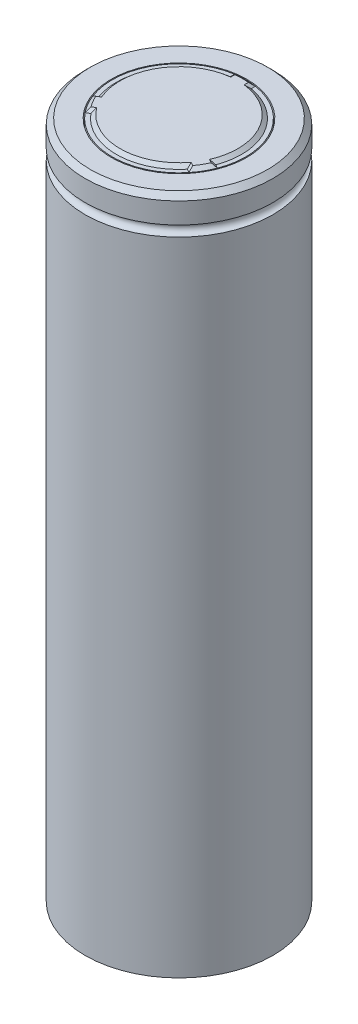
ISO-10303-21;
HEADER;
FILE_DESCRIPTION(('STEP AP214'),'2;1');
FILE_NAME('part.step','',(''),(''),'','','');
FILE_SCHEMA(('AUTOMOTIVE_DESIGN { 1 0 10303 214 1 1 1 1 }'));
ENDSEC;
DATA;
#1=APPLICATION_CONTEXT('core data for automotive mechanical design processes');
#2=APPLICATION_PROTOCOL_DEFINITION('international standard','automotive_design',2000,#1);
#3=PRODUCT_CONTEXT('',#1,'mechanical');
#4=PRODUCT('Part','Part','',(#3));
#5=PRODUCT_RELATED_PRODUCT_CATEGORY('part','',(#4));
#6=PRODUCT_DEFINITION_FORMATION('','',#4);
#7=PRODUCT_DEFINITION_CONTEXT('part definition',#1,'design');
#8=PRODUCT_DEFINITION('design','',#6,#7);
#9=PRODUCT_DEFINITION_SHAPE('','',#8);
#10=(LENGTH_UNIT() NAMED_UNIT(*) SI_UNIT(.MILLI.,.METRE.));
#11=(NAMED_UNIT(*) PLANE_ANGLE_UNIT() SI_UNIT($,.RADIAN.));
#12=(NAMED_UNIT(*) SI_UNIT($,.STERADIAN.) SOLID_ANGLE_UNIT());
#13=UNCERTAINTY_MEASURE_WITH_UNIT(LENGTH_MEASURE(1.E-05),#10,'distance_accuracy_value','');
#14=(GEOMETRIC_REPRESENTATION_CONTEXT(3) GLOBAL_UNCERTAINTY_ASSIGNED_CONTEXT((#13)) GLOBAL_UNIT_ASSIGNED_CONTEXT((#10,
#11,#12)) REPRESENTATION_CONTEXT('',''));
#15=CARTESIAN_POINT('',(0.,0.,0.));
#16=DIRECTION('',(0.,0.,1.));
#17=DIRECTION('',(1.,0.,0.));
#18=AXIS2_PLACEMENT_3D('',#15,#16,#17);
#19=CARTESIAN_POINT('',(0.,65.,0.));
#20=DIRECTION('',(0.,-1.,0.));
#21=DIRECTION('',(0.,0.,-1.));
#22=AXIS2_PLACEMENT_3D('',#19,#20,#21);
#23=CYLINDRICAL_SURFACE('',#22,9.);
#24=CARTESIAN_POINT('',(0.,0.,0.));
#25=DIRECTION('',(0.,1.,0.));
#26=DIRECTION('',(0.,0.,1.));
#27=AXIS2_PLACEMENT_3D('',#24,#25,#26);
#28=CIRCLE('',#27,9.);
#29=CARTESIAN_POINT('',(0.,0.,9.));
#30=VERTEX_POINT('',#29);
#31=EDGE_CURVE('E58',#30,#30,#28,.T.);
#32=ORIENTED_EDGE('',*,*,#31,.T.);
#33=EDGE_LOOP('',(#32));
#34=FACE_BOUND('',#33,.T.);
#35=CARTESIAN_POINT('',(0.,61.5,0.));
#36=DIRECTION('',(0.,1.,0.));
#37=DIRECTION('',(0.,0.,1.));
#38=AXIS2_PLACEMENT_3D('',#35,#36,#37);
#39=CIRCLE('',#38,9.);
#40=CARTESIAN_POINT('',(0.,61.5,9.));
#41=VERTEX_POINT('',#40);
#42=EDGE_CURVE('E64',#41,#41,#39,.T.);
#43=ORIENTED_EDGE('',*,*,#42,.F.);
#44=EDGE_LOOP('',(#43));
#45=FACE_BOUND('',#44,.T.);
#46=ADVANCED_FACE('F43',(#34,#45),#23,.T.);
#47=CARTESIAN_POINT('',(0.,0.,0.));
#48=DIRECTION('',(0.,1.,0.));
#49=DIRECTION('',(0.,0.,1.));
#50=AXIS2_PLACEMENT_3D('',#47,#48,#49);
#51=PLANE('',#50);
#52=CARTESIAN_POINT('',(0.,0.,0.));
#53=DIRECTION('',(0.,-1.,0.));
#54=DIRECTION('',(0.,0.,-1.));
#55=AXIS2_PLACEMENT_3D('',#52,#53,#54);
#56=CIRCLE('',#55,6.5);
#57=CARTESIAN_POINT('',(0.,0.,-6.5));
#58=VERTEX_POINT('',#57);
#59=EDGE_CURVE('E11',#58,#58,#56,.T.);
#60=ORIENTED_EDGE('',*,*,#59,.F.);
#61=EDGE_LOOP('',(#60));
#62=FACE_BOUND('',#61,.T.);
#63=ORIENTED_EDGE('',*,*,#31,.F.);
#64=EDGE_LOOP('',(#63));
#65=FACE_BOUND('',#64,.T.);
#66=ADVANCED_FACE('F45',(#62,#65),#51,.F.);
#67=CARTESIAN_POINT('',(0.,62.,0.));
#68=DIRECTION('',(0.,-1.,0.));
#69=DIRECTION('',(0.,0.,-1.));
#70=AXIS2_PLACEMENT_3D('',#67,#68,#69);
#71=TOROIDAL_SURFACE('',#70,9.,0.500000000000001);
#72=CARTESIAN_POINT('',(0.,62.5,0.));
#73=DIRECTION('',(0.,-1.,0.));
#74=DIRECTION('',(0.,0.,-1.));
#75=AXIS2_PLACEMENT_3D('',#72,#73,#74);
#76=CIRCLE('',#75,9.);
#77=CARTESIAN_POINT('',(0.,62.5,-9.));
#78=VERTEX_POINT('',#77);
#79=EDGE_CURVE('E61',#78,#78,#76,.T.);
#80=ORIENTED_EDGE('',*,*,#79,.T.);
#81=EDGE_LOOP('',(#80));
#82=FACE_BOUND('',#81,.T.);
#83=ORIENTED_EDGE('',*,*,#42,.T.);
#84=EDGE_LOOP('',(#83));
#85=FACE_BOUND('',#84,.T.);
#86=ADVANCED_FACE('F92',(#82,#85),#71,.F.);
#87=CARTESIAN_POINT('',(0.,65.,0.));
#88=DIRECTION('',(0.,1.,0.));
#89=DIRECTION('',(0.,0.,1.));
#90=AXIS2_PLACEMENT_3D('',#87,#88,#89);
#91=PLANE('',#90);
#92=CARTESIAN_POINT('',(0.,65.,0.));
#93=DIRECTION('',(0.,-1.,0.));
#94=DIRECTION('',(0.,0.,-1.));
#95=AXIS2_PLACEMENT_3D('',#92,#93,#94);
#96=CIRCLE('',#95,6.5);
#97=CARTESIAN_POINT('',(0.,65.,-6.5));
#98=VERTEX_POINT('',#97);
#99=EDGE_CURVE('E47',#98,#98,#96,.T.);
#100=ORIENTED_EDGE('',*,*,#99,.T.);
#101=EDGE_LOOP('',(#100));
#102=FACE_BOUND('',#101,.T.);
#103=CARTESIAN_POINT('',(0.,65.,0.));
#104=DIRECTION('',(0.,1.,0.));
#105=DIRECTION('',(0.,0.,1.));
#106=AXIS2_PLACEMENT_3D('',#103,#104,#105);
#107=CIRCLE('',#106,8.5);
#108=CARTESIAN_POINT('',(0.,65.,8.5));
#109=VERTEX_POINT('',#108);
#110=EDGE_CURVE('E55',#109,#109,#107,.T.);
#111=ORIENTED_EDGE('',*,*,#110,.T.);
#112=EDGE_LOOP('',(#111));
#113=FACE_BOUND('',#112,.T.);
#114=ADVANCED_FACE('F73',(#102,#113),#91,.T.);
#115=CARTESIAN_POINT('',(0.,64.5,0.));
#116=DIRECTION('',(0.,1.,0.));
#117=DIRECTION('',(0.,0.,1.));
#118=AXIS2_PLACEMENT_3D('',#115,#116,#117);
#119=CIRCLE('',#118,9.);
#120=CARTESIAN_POINT('',(0.,64.5,9.));
#121=VERTEX_POINT('',#120);
#122=EDGE_CURVE('E51',#121,#121,#119,.F.);
#123=ORIENTED_EDGE('',*,*,#122,.T.);
#124=EDGE_LOOP('',(#123));
#125=FACE_BOUND('',#124,.T.);
#126=ORIENTED_EDGE('',*,*,#79,.F.);
#127=EDGE_LOOP('',(#126));
#128=FACE_BOUND('',#127,.T.);
#129=ADVANCED_FACE('F82',(#125,#128),#23,.T.);
#130=CARTESIAN_POINT('',(0.,65.,0.));
#131=DIRECTION('',(0.,-1.,0.));
#132=DIRECTION('',(0.,0.,-1.));
#133=AXIS2_PLACEMENT_3D('',#130,#131,#132);
#134=CONICAL_SURFACE('',#133,8.5,0.785398163397447);
#135=ORIENTED_EDGE('',*,*,#122,.F.);
#136=EDGE_LOOP('',(#135));
#137=FACE_BOUND('',#136,.T.);
#138=ORIENTED_EDGE('',*,*,#110,.F.);
#139=EDGE_LOOP('',(#138));
#140=FACE_BOUND('',#139,.T.);
#141=ADVANCED_FACE('F77',(#137,#140),#134,.T.);
#142=CARTESIAN_POINT('',(0.,65.,0.));
#143=DIRECTION('',(0.,-1.,0.));
#144=DIRECTION('',(0.,0.,-1.));
#145=AXIS2_PLACEMENT_3D('',#142,#143,#144);
#146=CYLINDRICAL_SURFACE('',#145,6.5);
#147=ORIENTED_EDGE('',*,*,#99,.F.);
#148=EDGE_LOOP('',(#147));
#149=FACE_BOUND('',#148,.T.);
#150=ORIENTED_EDGE('',*,*,#59,.T.);
#151=EDGE_LOOP('',(#150));
#152=FACE_BOUND('',#151,.T.);
#153=ADVANCED_FACE('F75',(#149,#152),#146,.F.);
#154=CLOSED_SHELL('',(#46,#66,#86,#114,#129,#141,#153));
#155=MANIFOLD_SOLID_BREP('B2',#154);
#156=CARTESIAN_POINT('',(0.,65.,0.));
#157=DIRECTION('',(0.,1.,0.));
#158=DIRECTION('',(0.,0.,1.));
#159=AXIS2_PLACEMENT_3D('',#156,#157,#158);
#160=PLANE('',#159);
#161=DIRECTION('',(0.,0.,-1.));
#162=VECTOR('',#161,1.);
#163=CARTESIAN_POINT('',(1.,65.,-5.91607978309962));
#164=LINE('',#163,#162);
#165=CARTESIAN_POINT('',(1.,65.,-5.91607978309962));
#166=VERTEX_POINT('',#165);
#167=CARTESIAN_POINT('',(1.,65.,-6.32139225171164));
#168=VERTEX_POINT('',#167);
#169=EDGE_CURVE('E178',#166,#168,#164,.T.);
#170=ORIENTED_EDGE('',*,*,#169,.F.);
#171=CARTESIAN_POINT('',(0.,65.,0.));
#172=DIRECTION('',(0.,1.,0.));
#173=DIRECTION('',(0.,0.,1.));
#174=AXIS2_PLACEMENT_3D('',#171,#172,#173);
#175=CIRCLE('',#174,6.);
#176=CARTESIAN_POINT('',(5.62347538298004,65.,2.09201448776472));
#177=VERTEX_POINT('',#176);
#178=EDGE_CURVE('E182',#177,#166,#175,.T.);
#179=ORIENTED_EDGE('',*,*,#178,.F.);
#180=DIRECTION('',(-0.86602540378444,0.,-0.499999999999998));
#181=VECTOR('',#180,1.);
#182=CARTESIAN_POINT('',(5.62347538298004,65.,2.09201448776472));
#183=LINE('',#182,#181);
#184=CARTESIAN_POINT('',(5.97448627726865,65.,2.29467072207074));
#185=VERTEX_POINT('',#184);
#186=EDGE_CURVE('E461',#185,#177,#183,.T.);
#187=ORIENTED_EDGE('',*,*,#186,.F.);
#188=CARTESIAN_POINT('',(0.,65.,0.));
#189=DIRECTION('',(0.,-1.,0.));
#190=DIRECTION('',(0.,0.,-1.));
#191=AXIS2_PLACEMENT_3D('',#188,#189,#190);
#192=CIRCLE('',#191,6.4);
#193=EDGE_CURVE('E41',#168,#185,#192,.T.);
#194=ORIENTED_EDGE('',*,*,#193,.F.);
#195=EDGE_LOOP('',(#170,#179,#187,#194));
#196=FACE_BOUND('',#195,.T.);
#197=ADVANCED_FACE('F161',(#196),#160,.T.);
#198=DIRECTION('',(0.86602540378443,0.,0.500000000000014));
#199=VECTOR('',#198,1.);
#200=CARTESIAN_POINT('',(4.62347538298032,65.,3.82406529533362));
#201=LINE('',#200,#199);
#202=CARTESIAN_POINT('',(4.62347538298032,65.,3.82406529533362));
#203=VERTEX_POINT('',#202);
#204=CARTESIAN_POINT('',(4.9744862772689,65.,4.02672152963963));
#205=VERTEX_POINT('',#204);
#206=EDGE_CURVE('E455',#203,#205,#201,.T.);
#207=ORIENTED_EDGE('',*,*,#206,.F.);
#208=CARTESIAN_POINT('',(0.,65.,0.));
#209=DIRECTION('',(0.,1.,0.));
#210=DIRECTION('',(0.,0.,1.));
#211=AXIS2_PLACEMENT_3D('',#208,#209,#210);
#212=CIRCLE('',#211,6.);
#213=CARTESIAN_POINT('',(-4.62347538297945,65.,3.82406529533467));
#214=VERTEX_POINT('',#213);
#215=EDGE_CURVE('E452',#214,#203,#212,.T.);
#216=ORIENTED_EDGE('',*,*,#215,.F.);
#217=DIRECTION('',(0.866025403784399,0.,-0.500000000000068));
#218=VECTOR('',#217,1.);
#219=CARTESIAN_POINT('',(-4.62347538297945,65.,3.82406529533467));
#220=LINE('',#219,#218);
#221=CARTESIAN_POINT('',(-4.97448627726803,65.,4.02672152964071));
#222=VERTEX_POINT('',#221);
#223=EDGE_CURVE('E262',#222,#214,#220,.T.);
#224=ORIENTED_EDGE('',*,*,#223,.F.);
#225=EDGE_CURVE('E170',#205,#222,#192,.T.);
#226=ORIENTED_EDGE('',*,*,#225,.F.);
#227=EDGE_LOOP('',(#207,#216,#224,#226));
#228=FACE_BOUND('',#227,.T.);
#229=ADVANCED_FACE('F426',(#228),#160,.T.);
#230=DIRECTION('',(0.,0.,1.));
#231=VECTOR('',#230,1.);
#232=CARTESIAN_POINT('',(-1.,65.,-5.91607978309962));
#233=LINE('',#232,#231);
#234=CARTESIAN_POINT('',(-1.,65.,-6.32139225171164));
#235=VERTEX_POINT('',#234);
#236=CARTESIAN_POINT('',(-1.,65.,-5.91607978309962));
#237=VERTEX_POINT('',#236);
#238=EDGE_CURVE('E270',#235,#237,#233,.T.);
#239=ORIENTED_EDGE('',*,*,#238,.F.);
#240=CARTESIAN_POINT('',(-5.97448627726827,65.,2.29467072207195));
#241=VERTEX_POINT('',#240);
#242=EDGE_CURVE('E171',#241,#235,#192,.T.);
#243=ORIENTED_EDGE('',*,*,#242,.F.);
#244=DIRECTION('',(-0.866025403784439,0.,0.5));
#245=VECTOR('',#244,1.);
#246=CARTESIAN_POINT('',(-5.6234753829796,65.,2.09201448776591));
#247=LINE('',#246,#245);
#248=CARTESIAN_POINT('',(-5.6234753829796,65.,2.09201448776591));
#249=VERTEX_POINT('',#248);
#250=EDGE_CURVE('E263',#249,#241,#247,.T.);
#251=ORIENTED_EDGE('',*,*,#250,.F.);
#252=CARTESIAN_POINT('',(0.,65.,0.));
#253=DIRECTION('',(0.,1.,0.));
#254=DIRECTION('',(0.,0.,1.));
#255=AXIS2_PLACEMENT_3D('',#252,#253,#254);
#256=CIRCLE('',#255,6.);
#257=EDGE_CURVE('E279',#237,#249,#256,.T.);
#258=ORIENTED_EDGE('',*,*,#257,.F.);
#259=EDGE_LOOP('',(#239,#243,#251,#258));
#260=FACE_BOUND('',#259,.T.);
#261=ADVANCED_FACE('F267',(#260),#160,.T.);
#262=CARTESIAN_POINT('',(0.,65.,0.));
#263=DIRECTION('',(0.,-1.,0.));
#264=DIRECTION('',(0.,0.,-1.));
#265=AXIS2_PLACEMENT_3D('',#262,#263,#264);
#266=CYLINDRICAL_SURFACE('',#265,6.4);
#267=ORIENTED_EDGE('',*,*,#193,.T.);
#268=CARTESIAN_POINT('',(0.,65.,0.));
#269=DIRECTION('',(0.,1.,0.));
#270=DIRECTION('',(0.,0.,1.));
#271=AXIS2_PLACEMENT_3D('',#268,#269,#270);
#272=CIRCLE('',#271,6.4);
#273=EDGE_CURVE('E458',#205,#185,#272,.T.);
#274=ORIENTED_EDGE('',*,*,#273,.F.);
#275=ORIENTED_EDGE('',*,*,#225,.T.);
#276=CARTESIAN_POINT('',(0.,65.,0.));
#277=DIRECTION('',(0.,1.,0.));
#278=DIRECTION('',(0.,0.,1.));
#279=AXIS2_PLACEMENT_3D('',#276,#277,#278);
#280=CIRCLE('',#279,6.40000000000009);
#281=EDGE_CURVE('E252',#241,#222,#280,.T.);
#282=ORIENTED_EDGE('',*,*,#281,.F.);
#283=ORIENTED_EDGE('',*,*,#242,.T.);
#284=CARTESIAN_POINT('',(0.,65.,0.));
#285=DIRECTION('',(0.,1.,0.));
#286=DIRECTION('',(0.,0.,1.));
#287=AXIS2_PLACEMENT_3D('',#284,#285,#286);
#288=CIRCLE('',#287,6.4);
#289=EDGE_CURVE('E464',#168,#235,#288,.T.);
#290=ORIENTED_EDGE('',*,*,#289,.F.);
#291=EDGE_LOOP('',(#267,#274,#275,#282,#283,#290));
#292=FACE_BOUND('',#291,.T.);
#293=CARTESIAN_POINT('',(0.,0.,0.));
#294=DIRECTION('',(0.,-1.,0.));
#295=DIRECTION('',(0.,0.,-1.));
#296=AXIS2_PLACEMENT_3D('',#293,#294,#295);
#297=CIRCLE('',#296,6.4);
#298=CARTESIAN_POINT('',(0.,0.,-6.4));
#299=VERTEX_POINT('',#298);
#300=EDGE_CURVE('E165',#299,#299,#297,.T.);
#301=ORIENTED_EDGE('',*,*,#300,.F.);
#302=EDGE_LOOP('',(#301));
#303=FACE_BOUND('',#302,.T.);
#304=ADVANCED_FACE('F254',(#292,#303),#266,.T.);
#305=CARTESIAN_POINT('',(0.,0.,0.));
#306=DIRECTION('',(0.,1.,0.));
#307=DIRECTION('',(0.,0.,1.));
#308=AXIS2_PLACEMENT_3D('',#305,#306,#307);
#309=PLANE('',#308);
#310=ORIENTED_EDGE('',*,*,#300,.T.);
#311=EDGE_LOOP('',(#310));
#312=FACE_BOUND('',#311,.T.);
#313=ADVANCED_FACE('F163',(#312),#309,.F.);
#314=CARTESIAN_POINT('',(0.,65.,0.));
#315=DIRECTION('',(0.,-1.,0.));
#316=DIRECTION('',(0.,0.,1.));
#317=AXIS2_PLACEMENT_3D('',#314,#315,#316);
#318=CONICAL_SURFACE('',#317,6.,0.872664625997166);
#319=ORIENTED_EDGE('',*,*,#257,.T.);
#320=CARTESIAN_POINT('',(-5.17598251743624,65.3,2.24648991587919));
#321=CARTESIAN_POINT('',(-5.25115520215108,65.250412684668,2.22165286289833));
#322=CARTESIAN_POINT('',(-5.32603266043692,65.2006189971599,2.19636136828668));
#323=CARTESIAN_POINT('',(-5.47519694755329,65.1006189961826,2.14486955676353));
#324=CARTESIAN_POINT('',(-5.54948377778191,65.0504126836907,2.1186692420041));
#325=CARTESIAN_POINT('',(-5.62347538297961,65.,2.09201448776594));
#326=B_SPLINE_CURVE_WITH_KNOTS('',3,(#320,#321,#322,#323,#324,#325),.UNSPECIFIED.,.F.,.F.,(4,2,
4),(0.,0.280234442872825,0.560468222200871),.UNSPECIFIED.);
#327=CARTESIAN_POINT('',(-5.17598251743624,65.3,2.24648991587919));
#328=VERTEX_POINT('',#327);
#329=EDGE_CURVE('E277',#328,#249,#326,.T.);
#330=ORIENTED_EDGE('',*,*,#329,.F.);
#331=CARTESIAN_POINT('',(0.,65.3,0.));
#332=DIRECTION('',(0.,1.,0.));
#333=DIRECTION('',(0.,0.,1.));
#334=AXIS2_PLACEMENT_3D('',#331,#332,#333);
#335=CIRCLE('',#334,5.64247392222174);
#336=CARTESIAN_POINT('',(-0.642473922221742,65.3,-5.60577730758344));
#337=VERTEX_POINT('',#336);
#338=EDGE_CURVE('E301',#337,#328,#335,.T.);
#339=ORIENTED_EDGE('',*,*,#338,.F.);
#340=CARTESIAN_POINT('',(-0.642473922221742,65.3,-5.60577730758344));
#341=CARTESIAN_POINT('',(-0.701569783415724,65.250412684668,-5.65846023572674));
#342=CARTESIAN_POINT('',(-0.760911589392015,65.2006189971599,-5.71066026946726));
#343=CARTESIAN_POINT('',(-0.880086949816134,65.1006189961826,-5.81409442568584));
#344=CARTESIAN_POINT('',(-0.939920503099257,65.0504126836907,-5.86532855045072));
#345=CARTESIAN_POINT('',(-0.999999999999985,65.,-5.91607978309964));
#346=B_SPLINE_CURVE_WITH_KNOTS('',3,(#340,#341,#342,#343,#344,#345),.UNSPECIFIED.,.F.,.F.,(4,2,
4),(0.,0.280234442872816,0.560468222200854),.UNSPECIFIED.);
#347=EDGE_CURVE('E323',#337,#237,#346,.T.);
#348=ORIENTED_EDGE('',*,*,#347,.T.);
#349=EDGE_LOOP('',(#319,#330,#339,#348));
#350=FACE_BOUND('',#349,.T.);
#351=ADVANCED_FACE('F309',(#350),#318,.T.);
#352=CARTESIAN_POINT('',(-5.6234753829796,65.,2.09201448776591));
#353=DIRECTION('',(-0.321393804843269,0.766044443118979,-0.556670399226419));
#354=DIRECTION('',(0.,0.587858883152554,0.808963493304013));
#355=AXIS2_PLACEMENT_3D('',#352,#353,#354);
#356=PLANE('',#355);
#357=ORIENTED_EDGE('',*,*,#250,.T.);
#358=CARTESIAN_POINT('',(-5.52450889038715,65.3,2.44771171112208));
#359=CARTESIAN_POINT('',(-5.6000618867935,65.2503942101823,2.42306880811691));
#360=CARTESIAN_POINT('',(-5.6753365375039,65.20059129027,2.39799392777606));
#361=CARTESIAN_POINT('',(-5.82532899869278,65.1005912894875,2.34698026304472));
#362=CARTESIAN_POINT('',(-5.90004681027609,65.0503942093999,2.32104148036887));
#363=CARTESIAN_POINT('',(-5.97448627726828,65.,2.29467072207198));
#364=B_SPLINE_CURVE_WITH_KNOTS('',3,(#358,#359,#360,#361,#362,#363),.UNSPECIFIED.,.F.,.F.,(4,2,
4),(0.,0.281030570328733,0.562060582915407),.UNSPECIFIED.);
#365=CARTESIAN_POINT('',(-5.52450889038715,65.3,2.44771171112208));
#366=VERTEX_POINT('',#365);
#367=EDGE_CURVE('E274',#366,#241,#364,.T.);
#368=ORIENTED_EDGE('',*,*,#367,.F.);
#369=DIRECTION('',(0.866025403784439,0.,-0.5));
#370=VECTOR('',#369,1.);
#371=CARTESIAN_POINT('',(-5.44471234409047,65.3,2.40164115363729));
#372=LINE('',#371,#370);
#373=EDGE_CURVE('E469',#328,#366,#372,.F.);
#374=ORIENTED_EDGE('',*,*,#373,.F.);
#375=ORIENTED_EDGE('',*,*,#329,.T.);
#376=EDGE_LOOP('',(#357,#368,#374,#375));
#377=FACE_BOUND('',#376,.T.);
#378=ADVANCED_FACE('F273',(#377),#356,.T.);
#379=CARTESIAN_POINT('',(0.,65.,0.));
#380=DIRECTION('',(0.,-1.,0.));
#381=DIRECTION('',(0.,0.,1.));
#382=AXIS2_PLACEMENT_3D('',#379,#380,#381);
#383=CONICAL_SURFACE('',#382,6.40000000000009,0.872664625997166);
#384=ORIENTED_EDGE('',*,*,#281,.T.);
#385=CARTESIAN_POINT('',(-4.88203496816532,65.3,3.56050918694812));
#386=CARTESIAN_POINT('',(-4.898470086343,65.2503942101823,3.63826145267065));
#387=CARTESIAN_POINT('',(-4.91439192832616,65.20059129027,3.71598865261728));
#388=CARTESIAN_POINT('',(-4.94520902932311,65.1005912894875,3.87139276674868));
#389=CARTESIAN_POINT('',(-4.96010429037422,65.0503942093999,3.94906968103294));
#390=CARTESIAN_POINT('',(-4.97448627726814,65.,4.0267215296408));
#391=B_SPLINE_CURVE_WITH_KNOTS('',3,(#385,#386,#387,#388,#389,#390),.UNSPECIFIED.,.F.,.F.,(4,2,
4),(0.,0.28103057032874,0.562060582915426),.UNSPECIFIED.);
#392=CARTESIAN_POINT('',(-4.88203496816532,65.3,3.56050918694812));
#393=VERTEX_POINT('',#392);
#394=EDGE_CURVE('E283',#393,#222,#391,.T.);
#395=ORIENTED_EDGE('',*,*,#394,.F.);
#396=CARTESIAN_POINT('',(0.,65.3,0.));
#397=DIRECTION('',(0.,1.,0.));
#398=DIRECTION('',(0.,0.,1.));
#399=AXIS2_PLACEMENT_3D('',#396,#397,#398);
#400=CIRCLE('',#399,6.04247392222183);
#401=EDGE_CURVE('E282',#366,#393,#400,.T.);
#402=ORIENTED_EDGE('',*,*,#401,.F.);
#403=ORIENTED_EDGE('',*,*,#367,.T.);
#404=EDGE_LOOP('',(#384,#395,#402,#403));
#405=FACE_BOUND('',#404,.T.);
#406=ADVANCED_FACE('F281',(#405),#383,.T.);
#407=CARTESIAN_POINT('',(-4.62347538297945,65.,3.82406529533467));
#408=DIRECTION('',(0.321393804843313,0.766044443118979,0.556670399226393));
#409=DIRECTION('',(0.,-0.587858883152537,0.808963493304026));
#410=AXIS2_PLACEMENT_3D('',#407,#408,#409);
#411=PLANE('',#410);
#412=ORIENTED_EDGE('',*,*,#223,.T.);
#413=CARTESIAN_POINT('',(-4.53350859521441,65.3,3.35928739170519));
#414=CARTESIAN_POINT('',(-4.54958541873526,65.250412684668,3.43680737282935));
#415=CARTESIAN_POINT('',(-4.5651210710448,65.2006189971599,3.51429890118152));
#416=CARTESIAN_POINT('',(-4.59510999773703,65.1006189961826,3.66922486892327));
#417=CARTESIAN_POINT('',(-4.60956327468252,65.0504126836907,3.74665930844759));
#418=CARTESIAN_POINT('',(-4.62347538297948,65.,3.82406529533467));
#419=B_SPLINE_CURVE_WITH_KNOTS('',3,(#413,#414,#415,#416,#417,#418),.UNSPECIFIED.,.F.,.F.,(4,2,
4),(0.,0.280234442872815,0.560468222200852),.UNSPECIFIED.);
#420=CARTESIAN_POINT('',(-4.53350859521441,65.3,3.35928739170519));
#421=VERTEX_POINT('',#420);
#422=EDGE_CURVE('E286',#421,#214,#419,.T.);
#423=ORIENTED_EDGE('',*,*,#422,.F.);
#424=DIRECTION('',(-0.866025403784399,0.,0.500000000000068));
#425=VECTOR('',#424,1.);
#426=CARTESIAN_POINT('',(-4.8022384218686,65.3,3.5144386294633));
#427=LINE('',#426,#425);
#428=EDGE_CURVE('E471',#393,#421,#427,.F.);
#429=ORIENTED_EDGE('',*,*,#428,.F.);
#430=ORIENTED_EDGE('',*,*,#394,.T.);
#431=EDGE_LOOP('',(#412,#423,#429,#430));
#432=FACE_BOUND('',#431,.T.);
#433=ADVANCED_FACE('F414',(#432),#411,.T.);
#434=CARTESIAN_POINT('',(0.,65.,0.));
#435=DIRECTION('',(0.,-1.,0.));
#436=DIRECTION('',(0.,0.,1.));
#437=AXIS2_PLACEMENT_3D('',#434,#435,#436);
#438=CONICAL_SURFACE('',#437,6.,0.872664625997166);
#439=ORIENTED_EDGE('',*,*,#215,.T.);
#440=CARTESIAN_POINT('',(4.5335085952152,65.3,3.35928739170412));
#441=CARTESIAN_POINT('',(4.54958541873606,65.250412684668,3.43680737282828));
#442=CARTESIAN_POINT('',(4.56512107104562,65.2006189971599,3.51429890118046));
#443=CARTESIAN_POINT('',(4.59510999773788,65.1006189961826,3.66922486892222));
#444=CARTESIAN_POINT('',(4.60956327468337,65.0504126836907,3.74665930844654));
#445=CARTESIAN_POINT('',(4.62347538298034,65.,3.82406529533362));
#446=B_SPLINE_CURVE_WITH_KNOTS('',3,(#440,#441,#442,#443,#444,#445),.UNSPECIFIED.,.F.,.F.,(4,2,
4),(0.,0.28023444287283,0.560468222200881),.UNSPECIFIED.);
#447=CARTESIAN_POINT('',(4.5335085952152,65.3,3.35928739170412));
#448=VERTEX_POINT('',#447);
#449=EDGE_CURVE('E401',#448,#203,#446,.T.);
#450=ORIENTED_EDGE('',*,*,#449,.F.);
#451=CARTESIAN_POINT('',(0.,65.3,0.));
#452=DIRECTION('',(0.,1.,0.));
#453=DIRECTION('',(0.,0.,1.));
#454=AXIS2_PLACEMENT_3D('',#451,#452,#453);
#455=CIRCLE('',#454,5.64247392222174);
#456=EDGE_CURVE('E475',#421,#448,#455,.T.);
#457=ORIENTED_EDGE('',*,*,#456,.F.);
#458=ORIENTED_EDGE('',*,*,#422,.T.);
#459=EDGE_LOOP('',(#439,#450,#457,#458));
#460=FACE_BOUND('',#459,.T.);
#461=ADVANCED_FACE('F411',(#460),#438,.T.);
#462=CARTESIAN_POINT('',(4.62347538298032,65.,3.82406529533362));
#463=DIRECTION('',(-0.321393804843279,0.766044443118979,0.556670399226413));
#464=DIRECTION('',(0.,-0.587858883152551,0.808963493304015));
#465=AXIS2_PLACEMENT_3D('',#462,#463,#464);
#466=PLANE('',#465);
#467=ORIENTED_EDGE('',*,*,#206,.T.);
#468=CARTESIAN_POINT('',(4.88203496816604,65.3,3.56050918694698));
#469=CARTESIAN_POINT('',(4.89847008634373,65.2503942101823,3.6382614526695));
#470=CARTESIAN_POINT('',(4.9143919283269,65.20059129027,3.71598865261613));
#471=CARTESIAN_POINT('',(4.94520902932387,65.1005912894875,3.87139276674752));
#472=CARTESIAN_POINT('',(4.96010429037499,65.0503942093999,3.94906968103178));
#473=CARTESIAN_POINT('',(4.97448627726892,65.,4.02672152963963));
#474=B_SPLINE_CURVE_WITH_KNOTS('',3,(#468,#469,#470,#471,#472,#473),.UNSPECIFIED.,.F.,.F.,(4,2,
4),(0.,0.281030570328725,0.562060582915403),.UNSPECIFIED.);
#475=CARTESIAN_POINT('',(4.88203496816604,65.3,3.56050918694698));
#476=VERTEX_POINT('',#475);
#477=EDGE_CURVE('E394',#476,#205,#474,.T.);
#478=ORIENTED_EDGE('',*,*,#477,.F.);
#479=DIRECTION('',(-0.86602540378443,0.,-0.500000000000014));
#480=VECTOR('',#479,1.);
#481=CARTESIAN_POINT('',(4.80223842186945,65.3,3.51443862946224));
#482=LINE('',#481,#480);
#483=EDGE_CURVE('E477',#448,#476,#482,.F.);
#484=ORIENTED_EDGE('',*,*,#483,.F.);
#485=ORIENTED_EDGE('',*,*,#449,.T.);
#486=EDGE_LOOP('',(#467,#478,#484,#485));
#487=FACE_BOUND('',#486,.T.);
#488=ADVANCED_FACE('F389',(#487),#466,.T.);
#489=CARTESIAN_POINT('',(0.,65.,0.));
#490=DIRECTION('',(0.,-1.,0.));
#491=DIRECTION('',(0.,0.,1.));
#492=AXIS2_PLACEMENT_3D('',#489,#490,#491);
#493=CONICAL_SURFACE('',#492,6.4,0.872664625997166);
#494=ORIENTED_EDGE('',*,*,#273,.T.);
#495=CARTESIAN_POINT('',(5.52450889038758,65.3,2.44771171112089));
#496=CARTESIAN_POINT('',(5.60006188679392,65.2503942101823,2.42306880811571));
#497=CARTESIAN_POINT('',(5.67533653750431,65.20059129027,2.39799392777485));
#498=CARTESIAN_POINT('',(5.82532899869317,65.1005912894875,2.34698026304351));
#499=CARTESIAN_POINT('',(5.90004681027647,65.0503942093999,2.32104148036765));
#500=CARTESIAN_POINT('',(5.97448627726865,65.,2.29467072207075));
#501=B_SPLINE_CURVE_WITH_KNOTS('',3,(#495,#496,#497,#498,#499,#500),.UNSPECIFIED.,.F.,.F.,(4,2,
4),(0.,0.281030570328702,0.562060582915357),.UNSPECIFIED.);
#502=CARTESIAN_POINT('',(5.52450889038758,65.3,2.44771171112089));
#503=VERTEX_POINT('',#502);
#504=EDGE_CURVE('E373',#503,#185,#501,.T.);
#505=ORIENTED_EDGE('',*,*,#504,.F.);
#506=CARTESIAN_POINT('',(0.,65.3,0.));
#507=DIRECTION('',(0.,1.,0.));
#508=DIRECTION('',(0.,0.,1.));
#509=AXIS2_PLACEMENT_3D('',#506,#507,#508);
#510=CIRCLE('',#509,6.04247392222174);
#511=EDGE_CURVE('E479',#476,#503,#510,.T.);
#512=ORIENTED_EDGE('',*,*,#511,.F.);
#513=ORIENTED_EDGE('',*,*,#477,.T.);
#514=EDGE_LOOP('',(#494,#505,#512,#513));
#515=FACE_BOUND('',#514,.T.);
#516=ADVANCED_FACE('F383',(#515),#493,.T.);
#517=CARTESIAN_POINT('',(5.62347538298004,65.,2.09201448776472));
#518=DIRECTION('',(0.321393804843268,0.766044443118979,-0.556670399226419));
#519=DIRECTION('',(0.,0.587858883152555,0.808963493304013));
#520=AXIS2_PLACEMENT_3D('',#517,#518,#519);
#521=PLANE('',#520);
#522=ORIENTED_EDGE('',*,*,#186,.T.);
#523=CARTESIAN_POINT('',(5.17598251743673,65.3,2.24648991587803));
#524=CARTESIAN_POINT('',(5.25115520215157,65.250412684668,2.22165286289717));
#525=CARTESIAN_POINT('',(5.3260326604374,65.2006189971599,2.19636136828551));
#526=CARTESIAN_POINT('',(5.47519694755375,65.1006189961826,2.14486955676235));
#527=CARTESIAN_POINT('',(5.54948377778236,65.0504126836907,2.11866924200291));
#528=CARTESIAN_POINT('',(5.62347538298005,65.,2.09201448776475));
#529=B_SPLINE_CURVE_WITH_KNOTS('',3,(#523,#524,#525,#526,#527,#528),.UNSPECIFIED.,.F.,.F.,(4,2,
4),(0.,0.280234442872807,0.560468222200834),.UNSPECIFIED.);
#530=CARTESIAN_POINT('',(5.17598251743673,65.3,2.24648991587803));
#531=VERTEX_POINT('',#530);
#532=EDGE_CURVE('E366',#531,#177,#529,.T.);
#533=ORIENTED_EDGE('',*,*,#532,.F.);
#534=DIRECTION('',(0.86602540378444,0.,0.499999999999998));
#535=VECTOR('',#534,1.);
#536=CARTESIAN_POINT('',(5.44471234409091,65.3,2.4016411536361));
#537=LINE('',#536,#535);
#538=EDGE_CURVE('E481',#503,#531,#537,.F.);
#539=ORIENTED_EDGE('',*,*,#538,.F.);
#540=ORIENTED_EDGE('',*,*,#504,.T.);
#541=EDGE_LOOP('',(#522,#533,#539,#540));
#542=FACE_BOUND('',#541,.T.);
#543=ADVANCED_FACE('F380',(#542),#521,.T.);
#544=CARTESIAN_POINT('',(0.,65.,0.));
#545=DIRECTION('',(0.,-1.,0.));
#546=DIRECTION('',(0.,0.,1.));
#547=AXIS2_PLACEMENT_3D('',#544,#545,#546);
#548=CONICAL_SURFACE('',#547,6.,0.872664625997166);
#549=ORIENTED_EDGE('',*,*,#178,.T.);
#550=CARTESIAN_POINT('',(0.642473922221742,65.3,-5.60577730758344));
#551=CARTESIAN_POINT('',(0.701569783415724,65.250412684668,-5.65846023572674));
#552=CARTESIAN_POINT('',(0.760911589392015,65.2006189971599,-5.71066026946725));
#553=CARTESIAN_POINT('',(0.880086949816133,65.1006189961826,-5.81409442568584));
#554=CARTESIAN_POINT('',(0.939920503099257,65.0504126836907,-5.86532855045072));
#555=CARTESIAN_POINT('',(0.999999999999985,65.,-5.91607978309964));
#556=B_SPLINE_CURVE_WITH_KNOTS('',3,(#550,#551,#552,#553,#554,#555),.UNSPECIFIED.,.F.,.F.,(4,2,
4),(0.,0.280234442872816,0.560468222200854),.UNSPECIFIED.);
#557=CARTESIAN_POINT('',(0.642473922221742,65.3,-5.60577730758344));
#558=VERTEX_POINT('',#557);
#559=EDGE_CURVE('E359',#558,#166,#556,.T.);
#560=ORIENTED_EDGE('',*,*,#559,.F.);
#561=CARTESIAN_POINT('',(0.,65.3,0.));
#562=DIRECTION('',(0.,1.,0.));
#563=DIRECTION('',(0.,0.,1.));
#564=AXIS2_PLACEMENT_3D('',#561,#562,#563);
#565=CIRCLE('',#564,5.64247392222174);
#566=EDGE_CURVE('E483',#531,#558,#565,.T.);
#567=ORIENTED_EDGE('',*,*,#566,.F.);
#568=ORIENTED_EDGE('',*,*,#532,.T.);
#569=EDGE_LOOP('',(#549,#560,#567,#568));
#570=FACE_BOUND('',#569,.T.);
#571=ADVANCED_FACE('F354',(#570),#548,.T.);
#572=CARTESIAN_POINT('',(1.,65.,-5.91607978309962));
#573=DIRECTION('',(0.642787609686539,0.766044443118979,0.));
#574=DIRECTION('',(-0.766044443118979,0.642787609686539,0.));
#575=AXIS2_PLACEMENT_3D('',#572,#573,#574);
#576=PLANE('',#575);
#577=ORIENTED_EDGE('',*,*,#169,.T.);
#578=CARTESIAN_POINT('',(0.642473922221743,65.3,-6.00822089806915));
#579=CARTESIAN_POINT('',(0.701591800450397,65.2503942101823,-6.06133026078648));
#580=CARTESIAN_POINT('',(0.760944609177626,65.20059129027,-6.11398258039226));
#581=CARTESIAN_POINT('',(0.880119969369542,65.1005912894875,-6.2183730297923));
#582=CARTESIAN_POINT('',(0.93994251990173,65.0503942093999,-6.2701111614007));
#583=CARTESIAN_POINT('',(0.999999999999991,65.,-6.32139225171166));
#584=B_SPLINE_CURVE_WITH_KNOTS('',3,(#578,#579,#580,#581,#582,#583),.UNSPECIFIED.,.F.,.F.,(4,2,
4),(0.,0.281030570328711,0.562060582915376),.UNSPECIFIED.);
#585=CARTESIAN_POINT('',(0.642473922221743,65.3,-6.00822089806915));
#586=VERTEX_POINT('',#585);
#587=EDGE_CURVE('E338',#586,#168,#584,.T.);
#588=ORIENTED_EDGE('',*,*,#587,.F.);
#589=DIRECTION('',(0.,0.,1.));
#590=VECTOR('',#589,1.);
#591=CARTESIAN_POINT('',(0.642473922221743,65.3,-5.91607978309962));
#592=LINE('',#591,#590);
#593=EDGE_CURVE('E485',#558,#586,#592,.F.);
#594=ORIENTED_EDGE('',*,*,#593,.F.);
#595=ORIENTED_EDGE('',*,*,#559,.T.);
#596=EDGE_LOOP('',(#577,#588,#594,#595));
#597=FACE_BOUND('',#596,.T.);
#598=ADVANCED_FACE('F348',(#597),#576,.T.);
#599=CARTESIAN_POINT('',(0.,65.,0.));
#600=DIRECTION('',(0.,-1.,0.));
#601=DIRECTION('',(0.,0.,1.));
#602=AXIS2_PLACEMENT_3D('',#599,#600,#601);
#603=CONICAL_SURFACE('',#602,6.4,0.872664625997166);
#604=ORIENTED_EDGE('',*,*,#289,.T.);
#605=CARTESIAN_POINT('',(-0.642473922221743,65.3,-6.00822089806915));
#606=CARTESIAN_POINT('',(-0.701591800450397,65.2503942101823,-6.06133026078648));
#607=CARTESIAN_POINT('',(-0.760944609177626,65.20059129027,-6.11398258039226));
#608=CARTESIAN_POINT('',(-0.880119969369542,65.1005912894875,-6.2183730297923));
#609=CARTESIAN_POINT('',(-0.93994251990173,65.0503942093999,-6.2701111614007));
#610=CARTESIAN_POINT('',(-0.999999999999991,65.,-6.32139225171166));
#611=B_SPLINE_CURVE_WITH_KNOTS('',3,(#605,#606,#607,#608,#609,#610),.UNSPECIFIED.,.F.,.F.,(4,2,
4),(0.,0.281030570328711,0.562060582915376),.UNSPECIFIED.);
#612=CARTESIAN_POINT('',(-0.642473922221743,65.3,-6.00822089806915));
#613=VERTEX_POINT('',#612);
#614=EDGE_CURVE('E330',#613,#235,#611,.T.);
#615=ORIENTED_EDGE('',*,*,#614,.F.);
#616=CARTESIAN_POINT('',(0.,65.3,0.));
#617=DIRECTION('',(0.,1.,0.));
#618=DIRECTION('',(0.,0.,1.));
#619=AXIS2_PLACEMENT_3D('',#616,#617,#618);
#620=CIRCLE('',#619,6.04247392222174);
#621=EDGE_CURVE('E487',#586,#613,#620,.T.);
#622=ORIENTED_EDGE('',*,*,#621,.F.);
#623=ORIENTED_EDGE('',*,*,#587,.T.);
#624=EDGE_LOOP('',(#604,#615,#622,#623));
#625=FACE_BOUND('',#624,.T.);
#626=ADVANCED_FACE('F345',(#625),#603,.T.);
#627=CARTESIAN_POINT('',(-1.,65.,-5.91607978309962));
#628=DIRECTION('',(-0.642787609686539,0.766044443118979,0.));
#629=DIRECTION('',(-0.766044443118979,-0.642787609686539,0.));
#630=AXIS2_PLACEMENT_3D('',#627,#628,#629);
#631=PLANE('',#630);
#632=ORIENTED_EDGE('',*,*,#238,.T.);
#633=ORIENTED_EDGE('',*,*,#347,.F.);
#634=DIRECTION('',(0.,0.,-1.));
#635=VECTOR('',#634,1.);
#636=CARTESIAN_POINT('',(-0.642473922221743,65.3,-5.91607978309962));
#637=LINE('',#636,#635);
#638=EDGE_CURVE('E331',#613,#337,#637,.F.);
#639=ORIENTED_EDGE('',*,*,#638,.F.);
#640=ORIENTED_EDGE('',*,*,#614,.T.);
#641=EDGE_LOOP('',(#632,#633,#639,#640));
#642=FACE_BOUND('',#641,.T.);
#643=ADVANCED_FACE('F312',(#642),#631,.T.);
#644=CARTESIAN_POINT('',(0.,65.3,0.));
#645=DIRECTION('',(0.,1.,0.));
#646=DIRECTION('',(0.,0.,1.));
#647=AXIS2_PLACEMENT_3D('',#644,#645,#646);
#648=PLANE('',#647);
#649=ORIENTED_EDGE('',*,*,#338,.T.);
#650=ORIENTED_EDGE('',*,*,#373,.T.);
#651=ORIENTED_EDGE('',*,*,#401,.T.);
#652=ORIENTED_EDGE('',*,*,#428,.T.);
#653=ORIENTED_EDGE('',*,*,#456,.T.);
#654=ORIENTED_EDGE('',*,*,#483,.T.);
#655=ORIENTED_EDGE('',*,*,#511,.T.);
#656=ORIENTED_EDGE('',*,*,#538,.T.);
#657=ORIENTED_EDGE('',*,*,#566,.T.);
#658=ORIENTED_EDGE('',*,*,#593,.T.);
#659=ORIENTED_EDGE('',*,*,#621,.T.);
#660=ORIENTED_EDGE('',*,*,#638,.T.);
#661=EDGE_LOOP('',(#649,#650,#651,#652,#653,#654,#655,#656,#657,#658,#659,#660));
#662=FACE_BOUND('',#661,.T.);
#663=ADVANCED_FACE('F490',(#662),#648,.T.);
#664=CLOSED_SHELL('',(#197,#229,#261,#304,#313,#351,#378,#406,#433,#461,#488,#516,#543,#571,
#598,#626,#643,#663));
#665=MANIFOLD_SOLID_BREP('B6',#664);
#666=ADVANCED_BREP_SHAPE_REPRESENTATION('',(#18,#155,#665),#14);
#667=SHAPE_DEFINITION_REPRESENTATION(#9,#666);
ENDSEC;
END-ISO-10303-21;
